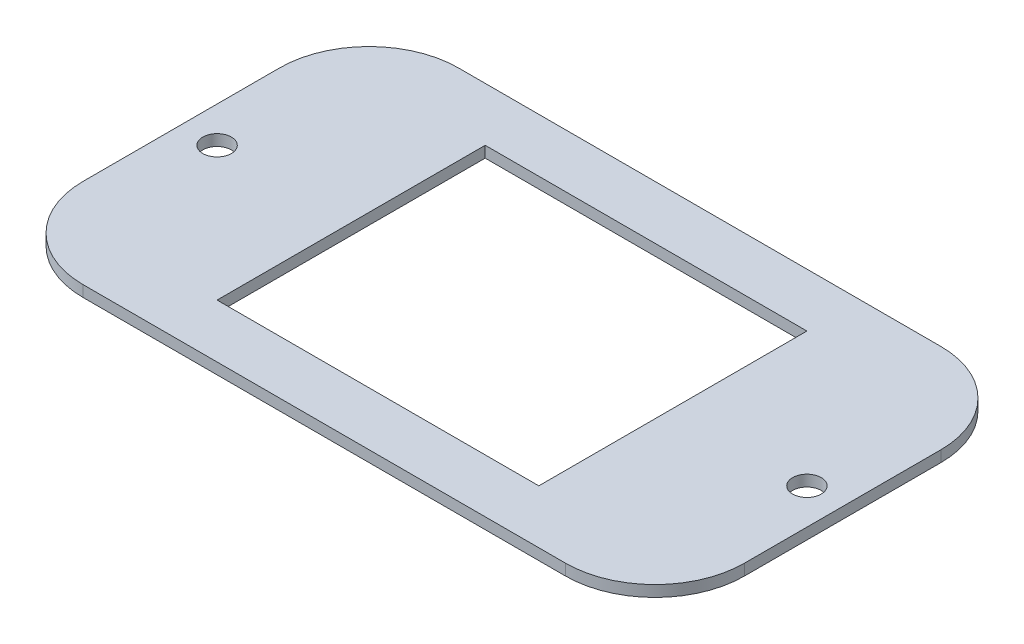
ISO-10303-21;
HEADER;
FILE_DESCRIPTION(('STEP AP214'),'2;1');
FILE_NAME('part.step','',(''),(''),'','','');
FILE_SCHEMA(('AUTOMOTIVE_DESIGN { 1 0 10303 214 1 1 1 1 }'));
ENDSEC;
DATA;
#1=APPLICATION_CONTEXT('core data for automotive mechanical design processes');
#2=APPLICATION_PROTOCOL_DEFINITION('international standard','automotive_design',2000,#1);
#3=PRODUCT_CONTEXT('',#1,'mechanical');
#4=PRODUCT('Part','Part','',(#3));
#5=PRODUCT_RELATED_PRODUCT_CATEGORY('part','',(#4));
#6=PRODUCT_DEFINITION_FORMATION('','',#4);
#7=PRODUCT_DEFINITION_CONTEXT('part definition',#1,'design');
#8=PRODUCT_DEFINITION('design','',#6,#7);
#9=PRODUCT_DEFINITION_SHAPE('','',#8);
#10=(LENGTH_UNIT() NAMED_UNIT(*) SI_UNIT(.MILLI.,.METRE.));
#11=(NAMED_UNIT(*) PLANE_ANGLE_UNIT() SI_UNIT($,.RADIAN.));
#12=(NAMED_UNIT(*) SI_UNIT($,.STERADIAN.) SOLID_ANGLE_UNIT());
#13=UNCERTAINTY_MEASURE_WITH_UNIT(LENGTH_MEASURE(1.E-05),#10,'distance_accuracy_value','');
#14=(GEOMETRIC_REPRESENTATION_CONTEXT(3) GLOBAL_UNCERTAINTY_ASSIGNED_CONTEXT((#13)) GLOBAL_UNIT_ASSIGNED_CONTEXT((#10,
#11,#12)) REPRESENTATION_CONTEXT('',''));
#15=CARTESIAN_POINT('',(0.,0.,0.));
#16=DIRECTION('',(0.,0.,1.));
#17=DIRECTION('',(1.,0.,0.));
#18=AXIS2_PLACEMENT_3D('',#15,#16,#17);
#19=CARTESIAN_POINT('',(0.,1.25,0.));
#20=DIRECTION('',(0.,-1.,0.));
#21=DIRECTION('',(0.,0.,-1.));
#22=AXIS2_PLACEMENT_3D('',#19,#20,#21);
#23=PLANE('',#22);
#24=CARTESIAN_POINT('',(33.,1.25,0.));
#25=DIRECTION('',(0.,1.,0.));
#26=DIRECTION('',(0.,0.,-1.));
#27=AXIS2_PLACEMENT_3D('',#24,#25,#26);
#28=CIRCLE('',#27,1.60000000000001);
#29=CARTESIAN_POINT('',(33.,1.25,-1.6));
#30=VERTEX_POINT('',#29);
#31=EDGE_CURVE('E191',#30,#30,#28,.T.);
#32=ORIENTED_EDGE('',*,*,#31,.F.);
#33=EDGE_LOOP('',(#32));
#34=FACE_BOUND('',#33,.T.);
#35=CARTESIAN_POINT('',(-33.,1.25,0.));
#36=DIRECTION('',(0.,1.,0.));
#37=DIRECTION('',(0.,0.,1.));
#38=AXIS2_PLACEMENT_3D('',#35,#36,#37);
#39=CIRCLE('',#38,1.60000000000001);
#40=CARTESIAN_POINT('',(-33.,1.25,1.60000000000001));
#41=VERTEX_POINT('',#40);
#42=EDGE_CURVE('E199',#41,#41,#39,.T.);
#43=ORIENTED_EDGE('',*,*,#42,.F.);
#44=EDGE_LOOP('',(#43));
#45=FACE_BOUND('',#44,.T.);
#46=DIRECTION('',(0.,0.,-1.));
#47=VECTOR('',#46,1.);
#48=CARTESIAN_POINT('',(37.,1.25,21.));
#49=LINE('',#48,#47);
#50=CARTESIAN_POINT('',(37.,1.25,11.));
#51=VERTEX_POINT('',#50);
#52=CARTESIAN_POINT('',(37.,1.25,-11.));
#53=VERTEX_POINT('',#52);
#54=EDGE_CURVE('E207',#51,#53,#49,.T.);
#55=ORIENTED_EDGE('',*,*,#54,.T.);
#56=CARTESIAN_POINT('',(27.,1.25,-11.));
#57=DIRECTION('',(0.,-1.,0.));
#58=DIRECTION('',(0.,0.,-1.));
#59=AXIS2_PLACEMENT_3D('',#56,#57,#58);
#60=CIRCLE('',#59,10.);
#61=CARTESIAN_POINT('',(27.,1.25,-21.));
#62=VERTEX_POINT('',#61);
#63=EDGE_CURVE('E269',#53,#62,#60,.F.);
#64=ORIENTED_EDGE('',*,*,#63,.T.);
#65=DIRECTION('',(-1.,0.,0.));
#66=VECTOR('',#65,1.);
#67=CARTESIAN_POINT('',(-37.,1.25,-21.));
#68=LINE('',#67,#66);
#69=CARTESIAN_POINT('',(-27.,1.25,-21.));
#70=VERTEX_POINT('',#69);
#71=EDGE_CURVE('E211',#62,#70,#68,.T.);
#72=ORIENTED_EDGE('',*,*,#71,.T.);
#73=CARTESIAN_POINT('',(-27.,1.25,-11.));
#74=DIRECTION('',(0.,-1.,0.));
#75=DIRECTION('',(0.,0.,-1.));
#76=AXIS2_PLACEMENT_3D('',#73,#74,#75);
#77=CIRCLE('',#76,10.);
#78=CARTESIAN_POINT('',(-37.,1.25,-11.));
#79=VERTEX_POINT('',#78);
#80=EDGE_CURVE('E263',#70,#79,#77,.F.);
#81=ORIENTED_EDGE('',*,*,#80,.T.);
#82=DIRECTION('',(0.,0.,1.));
#83=VECTOR('',#82,1.);
#84=CARTESIAN_POINT('',(-37.,1.25,21.));
#85=LINE('',#84,#83);
#86=CARTESIAN_POINT('',(-37.,1.25,11.));
#87=VERTEX_POINT('',#86);
#88=EDGE_CURVE('E216',#79,#87,#85,.T.);
#89=ORIENTED_EDGE('',*,*,#88,.T.);
#90=CARTESIAN_POINT('',(-27.,1.25,11.));
#91=DIRECTION('',(0.,-1.,0.));
#92=DIRECTION('',(0.,0.,-1.));
#93=AXIS2_PLACEMENT_3D('',#90,#91,#92);
#94=CIRCLE('',#93,10.);
#95=CARTESIAN_POINT('',(-27.,1.25,21.));
#96=VERTEX_POINT('',#95);
#97=EDGE_CURVE('E68',#87,#96,#94,.F.);
#98=ORIENTED_EDGE('',*,*,#97,.T.);
#99=DIRECTION('',(1.,0.,0.));
#100=VECTOR('',#99,1.);
#101=CARTESIAN_POINT('',(-37.,1.25,21.));
#102=LINE('',#101,#100);
#103=CARTESIAN_POINT('',(27.,1.25,21.));
#104=VERTEX_POINT('',#103);
#105=EDGE_CURVE('E219',#96,#104,#102,.T.);
#106=ORIENTED_EDGE('',*,*,#105,.T.);
#107=CARTESIAN_POINT('',(27.,1.25,11.));
#108=DIRECTION('',(0.,-1.,0.));
#109=DIRECTION('',(0.,0.,-1.));
#110=AXIS2_PLACEMENT_3D('',#107,#108,#109);
#111=CIRCLE('',#110,10.);
#112=EDGE_CURVE('E266',#104,#51,#111,.F.);
#113=ORIENTED_EDGE('',*,*,#112,.T.);
#114=EDGE_LOOP('',(#55,#64,#72,#81,#89,#98,#106,#113));
#115=FACE_BOUND('',#114,.T.);
#116=DIRECTION('',(0.,0.,1.));
#117=VECTOR('',#116,1.);
#118=CARTESIAN_POINT('',(-18.,1.25,15.));
#119=LINE('',#118,#117);
#120=CARTESIAN_POINT('',(-18.,1.25,-15.));
#121=VERTEX_POINT('',#120);
#122=CARTESIAN_POINT('',(-18.,1.25,15.));
#123=VERTEX_POINT('',#122);
#124=EDGE_CURVE('E138',#121,#123,#119,.T.);
#125=ORIENTED_EDGE('',*,*,#124,.F.);
#126=DIRECTION('',(-1.,0.,0.));
#127=VECTOR('',#126,1.);
#128=CARTESIAN_POINT('',(18.,1.25,-15.));
#129=LINE('',#128,#127);
#130=CARTESIAN_POINT('',(18.,1.25,-15.));
#131=VERTEX_POINT('',#130);
#132=EDGE_CURVE('E167',#131,#121,#129,.T.);
#133=ORIENTED_EDGE('',*,*,#132,.F.);
#134=DIRECTION('',(0.,0.,-1.));
#135=VECTOR('',#134,1.);
#136=CARTESIAN_POINT('',(18.,1.25,15.));
#137=LINE('',#136,#135);
#138=CARTESIAN_POINT('',(18.,1.25,15.));
#139=VERTEX_POINT('',#138);
#140=EDGE_CURVE('E163',#139,#131,#137,.T.);
#141=ORIENTED_EDGE('',*,*,#140,.F.);
#142=DIRECTION('',(1.,0.,0.));
#143=VECTOR('',#142,1.);
#144=CARTESIAN_POINT('',(18.,1.25,15.));
#145=LINE('',#144,#143);
#146=EDGE_CURVE('E149',#123,#139,#145,.T.);
#147=ORIENTED_EDGE('',*,*,#146,.F.);
#148=EDGE_LOOP('',(#125,#133,#141,#147));
#149=FACE_BOUND('',#148,.T.);
#150=ADVANCED_FACE('F45',(#34,#45,#115,#149),#23,.F.);
#151=CARTESIAN_POINT('',(0.,0.,0.));
#152=DIRECTION('',(0.,-1.,0.));
#153=DIRECTION('',(0.,0.,-1.));
#154=AXIS2_PLACEMENT_3D('',#151,#152,#153);
#155=PLANE('',#154);
#156=CARTESIAN_POINT('',(-33.,0.,0.));
#157=DIRECTION('',(0.,1.,0.));
#158=DIRECTION('',(0.,0.,1.));
#159=AXIS2_PLACEMENT_3D('',#156,#157,#158);
#160=CIRCLE('',#159,1.60000000000001);
#161=CARTESIAN_POINT('',(-33.,0.,1.60000000000001));
#162=VERTEX_POINT('',#161);
#163=EDGE_CURVE('E195',#162,#162,#160,.T.);
#164=ORIENTED_EDGE('',*,*,#163,.T.);
#165=EDGE_LOOP('',(#164));
#166=FACE_BOUND('',#165,.T.);
#167=DIRECTION('',(-1.,0.,0.));
#168=VECTOR('',#167,1.);
#169=CARTESIAN_POINT('',(-37.,0.,-21.));
#170=LINE('',#169,#168);
#171=CARTESIAN_POINT('',(27.,0.,-21.));
#172=VERTEX_POINT('',#171);
#173=CARTESIAN_POINT('',(-27.,0.,-21.));
#174=VERTEX_POINT('',#173);
#175=EDGE_CURVE('E226',#172,#174,#170,.T.);
#176=ORIENTED_EDGE('',*,*,#175,.F.);
#177=CARTESIAN_POINT('',(27.,0.,-11.));
#178=DIRECTION('',(0.,-1.,0.));
#179=DIRECTION('',(0.,0.,-1.));
#180=AXIS2_PLACEMENT_3D('',#177,#178,#179);
#181=CIRCLE('',#180,10.);
#182=CARTESIAN_POINT('',(37.,0.,-11.));
#183=VERTEX_POINT('',#182);
#184=EDGE_CURVE('E251',#172,#183,#181,.T.);
#185=ORIENTED_EDGE('',*,*,#184,.T.);
#186=DIRECTION('',(0.,0.,-1.));
#187=VECTOR('',#186,1.);
#188=CARTESIAN_POINT('',(37.,0.,21.));
#189=LINE('',#188,#187);
#190=CARTESIAN_POINT('',(37.,0.,11.));
#191=VERTEX_POINT('',#190);
#192=EDGE_CURVE('E203',#191,#183,#189,.T.);
#193=ORIENTED_EDGE('',*,*,#192,.F.);
#194=CARTESIAN_POINT('',(27.,0.,11.));
#195=DIRECTION('',(0.,-1.,0.));
#196=DIRECTION('',(0.,0.,-1.));
#197=AXIS2_PLACEMENT_3D('',#194,#195,#196);
#198=CIRCLE('',#197,10.);
#199=CARTESIAN_POINT('',(27.,0.,21.));
#200=VERTEX_POINT('',#199);
#201=EDGE_CURVE('E248',#191,#200,#198,.T.);
#202=ORIENTED_EDGE('',*,*,#201,.T.);
#203=DIRECTION('',(1.,0.,0.));
#204=VECTOR('',#203,1.);
#205=CARTESIAN_POINT('',(-37.,0.,21.));
#206=LINE('',#205,#204);
#207=CARTESIAN_POINT('',(-27.,0.,21.));
#208=VERTEX_POINT('',#207);
#209=EDGE_CURVE('E212',#208,#200,#206,.T.);
#210=ORIENTED_EDGE('',*,*,#209,.F.);
#211=CARTESIAN_POINT('',(-27.,0.,11.));
#212=DIRECTION('',(0.,-1.,0.));
#213=DIRECTION('',(0.,0.,-1.));
#214=AXIS2_PLACEMENT_3D('',#211,#212,#213);
#215=CIRCLE('',#214,10.);
#216=CARTESIAN_POINT('',(-37.,0.,11.));
#217=VERTEX_POINT('',#216);
#218=EDGE_CURVE('E242',#208,#217,#215,.T.);
#219=ORIENTED_EDGE('',*,*,#218,.T.);
#220=DIRECTION('',(0.,0.,1.));
#221=VECTOR('',#220,1.);
#222=CARTESIAN_POINT('',(-37.,0.,21.));
#223=LINE('',#222,#221);
#224=CARTESIAN_POINT('',(-37.,0.,-11.));
#225=VERTEX_POINT('',#224);
#226=EDGE_CURVE('E230',#225,#217,#223,.T.);
#227=ORIENTED_EDGE('',*,*,#226,.F.);
#228=CARTESIAN_POINT('',(-27.,0.,-11.));
#229=DIRECTION('',(0.,-1.,0.));
#230=DIRECTION('',(0.,0.,-1.));
#231=AXIS2_PLACEMENT_3D('',#228,#229,#230);
#232=CIRCLE('',#231,10.);
#233=EDGE_CURVE('E245',#225,#174,#232,.T.);
#234=ORIENTED_EDGE('',*,*,#233,.T.);
#235=EDGE_LOOP('',(#176,#185,#193,#202,#210,#219,#227,#234));
#236=FACE_BOUND('',#235,.T.);
#237=CARTESIAN_POINT('',(33.,0.,0.));
#238=DIRECTION('',(0.,1.,0.));
#239=DIRECTION('',(0.,0.,-1.));
#240=AXIS2_PLACEMENT_3D('',#237,#238,#239);
#241=CIRCLE('',#240,1.60000000000001);
#242=CARTESIAN_POINT('',(33.,0.,-1.6));
#243=VERTEX_POINT('',#242);
#244=EDGE_CURVE('E158',#243,#243,#241,.T.);
#245=ORIENTED_EDGE('',*,*,#244,.T.);
#246=EDGE_LOOP('',(#245));
#247=FACE_BOUND('',#246,.T.);
#248=DIRECTION('',(-1.,0.,0.));
#249=VECTOR('',#248,1.);
#250=CARTESIAN_POINT('',(18.,0.,-15.));
#251=LINE('',#250,#249);
#252=CARTESIAN_POINT('',(18.,0.,-15.));
#253=VERTEX_POINT('',#252);
#254=CARTESIAN_POINT('',(-18.,0.,-15.));
#255=VERTEX_POINT('',#254);
#256=EDGE_CURVE('E150',#253,#255,#251,.T.);
#257=ORIENTED_EDGE('',*,*,#256,.T.);
#258=DIRECTION('',(0.,0.,1.));
#259=VECTOR('',#258,1.);
#260=CARTESIAN_POINT('',(-18.,0.,15.));
#261=LINE('',#260,#259);
#262=CARTESIAN_POINT('',(-18.,0.,15.));
#263=VERTEX_POINT('',#262);
#264=EDGE_CURVE('E172',#255,#263,#261,.T.);
#265=ORIENTED_EDGE('',*,*,#264,.T.);
#266=DIRECTION('',(1.,0.,0.));
#267=VECTOR('',#266,1.);
#268=CARTESIAN_POINT('',(18.,0.,15.));
#269=LINE('',#268,#267);
#270=CARTESIAN_POINT('',(18.,0.,15.));
#271=VERTEX_POINT('',#270);
#272=EDGE_CURVE('E156',#263,#271,#269,.T.);
#273=ORIENTED_EDGE('',*,*,#272,.T.);
#274=DIRECTION('',(0.,0.,-1.));
#275=VECTOR('',#274,1.);
#276=CARTESIAN_POINT('',(18.,0.,15.));
#277=LINE('',#276,#275);
#278=EDGE_CURVE('E177',#271,#253,#277,.T.);
#279=ORIENTED_EDGE('',*,*,#278,.T.);
#280=EDGE_LOOP('',(#257,#265,#273,#279));
#281=FACE_BOUND('',#280,.T.);
#282=ADVANCED_FACE('F291',(#166,#236,#247,#281),#155,.T.);
#283=CARTESIAN_POINT('',(37.,1.25,21.));
#284=DIRECTION('',(-1.,0.,0.));
#285=DIRECTION('',(0.,0.,1.));
#286=AXIS2_PLACEMENT_3D('',#283,#284,#285);
#287=PLANE('',#286);
#288=ORIENTED_EDGE('',*,*,#192,.T.);
#289=DIRECTION('',(0.,-1.,0.));
#290=VECTOR('',#289,1.);
#291=CARTESIAN_POINT('',(37.,1.25,-11.));
#292=LINE('',#291,#290);
#293=EDGE_CURVE('E258',#183,#53,#292,.F.);
#294=ORIENTED_EDGE('',*,*,#293,.T.);
#295=ORIENTED_EDGE('',*,*,#54,.F.);
#296=DIRECTION('',(0.,-1.,0.));
#297=VECTOR('',#296,1.);
#298=CARTESIAN_POINT('',(37.,1.25,11.));
#299=LINE('',#298,#297);
#300=EDGE_CURVE('E254',#51,#191,#299,.T.);
#301=ORIENTED_EDGE('',*,*,#300,.T.);
#302=EDGE_LOOP('',(#288,#294,#295,#301));
#303=FACE_BOUND('',#302,.T.);
#304=ADVANCED_FACE('F300',(#303),#287,.F.);
#305=CARTESIAN_POINT('',(-37.,1.25,-21.));
#306=DIRECTION('',(0.,0.,1.));
#307=DIRECTION('',(1.,0.,0.));
#308=AXIS2_PLACEMENT_3D('',#305,#306,#307);
#309=PLANE('',#308);
#310=ORIENTED_EDGE('',*,*,#71,.F.);
#311=DIRECTION('',(0.,-1.,0.));
#312=VECTOR('',#311,1.);
#313=CARTESIAN_POINT('',(27.,1.25,-21.));
#314=LINE('',#313,#312);
#315=EDGE_CURVE('E238',#62,#172,#314,.T.);
#316=ORIENTED_EDGE('',*,*,#315,.T.);
#317=ORIENTED_EDGE('',*,*,#175,.T.);
#318=DIRECTION('',(0.,-1.,0.));
#319=VECTOR('',#318,1.);
#320=CARTESIAN_POINT('',(-27.,1.25,-21.));
#321=LINE('',#320,#319);
#322=EDGE_CURVE('E222',#174,#70,#321,.F.);
#323=ORIENTED_EDGE('',*,*,#322,.T.);
#324=EDGE_LOOP('',(#310,#316,#317,#323));
#325=FACE_BOUND('',#324,.T.);
#326=ADVANCED_FACE('F308',(#325),#309,.F.);
#327=CARTESIAN_POINT('',(-37.,1.25,21.));
#328=DIRECTION('',(1.,0.,0.));
#329=DIRECTION('',(0.,0.,-1.));
#330=AXIS2_PLACEMENT_3D('',#327,#328,#329);
#331=PLANE('',#330);
#332=ORIENTED_EDGE('',*,*,#88,.F.);
#333=DIRECTION('',(0.,-1.,0.));
#334=VECTOR('',#333,1.);
#335=CARTESIAN_POINT('',(-37.,1.25,-11.));
#336=LINE('',#335,#334);
#337=EDGE_CURVE('E11',#79,#225,#336,.T.);
#338=ORIENTED_EDGE('',*,*,#337,.T.);
#339=ORIENTED_EDGE('',*,*,#226,.T.);
#340=DIRECTION('',(0.,-1.,0.));
#341=VECTOR('',#340,1.);
#342=CARTESIAN_POINT('',(-37.,1.25,11.));
#343=LINE('',#342,#341);
#344=EDGE_CURVE('E54',#217,#87,#343,.F.);
#345=ORIENTED_EDGE('',*,*,#344,.T.);
#346=EDGE_LOOP('',(#332,#338,#339,#345));
#347=FACE_BOUND('',#346,.T.);
#348=ADVANCED_FACE('F281',(#347),#331,.F.);
#349=CARTESIAN_POINT('',(-37.,1.25,21.));
#350=DIRECTION('',(0.,0.,-1.));
#351=DIRECTION('',(-1.,0.,0.));
#352=AXIS2_PLACEMENT_3D('',#349,#350,#351);
#353=PLANE('',#352);
#354=ORIENTED_EDGE('',*,*,#209,.T.);
#355=DIRECTION('',(0.,-1.,0.));
#356=VECTOR('',#355,1.);
#357=CARTESIAN_POINT('',(27.,1.25,21.));
#358=LINE('',#357,#356);
#359=EDGE_CURVE('E61',#200,#104,#358,.F.);
#360=ORIENTED_EDGE('',*,*,#359,.T.);
#361=ORIENTED_EDGE('',*,*,#105,.F.);
#362=DIRECTION('',(0.,-1.,0.));
#363=VECTOR('',#362,1.);
#364=CARTESIAN_POINT('',(-27.,1.25,21.));
#365=LINE('',#364,#363);
#366=EDGE_CURVE('E272',#96,#208,#365,.T.);
#367=ORIENTED_EDGE('',*,*,#366,.T.);
#368=EDGE_LOOP('',(#354,#360,#361,#367));
#369=FACE_BOUND('',#368,.T.);
#370=ADVANCED_FACE('F288',(#369),#353,.F.);
#371=CARTESIAN_POINT('',(-33.,1.25,0.));
#372=DIRECTION('',(0.,-1.,0.));
#373=DIRECTION('',(0.,0.,-1.));
#374=AXIS2_PLACEMENT_3D('',#371,#372,#373);
#375=CYLINDRICAL_SURFACE('',#374,1.60000000000001);
#376=ORIENTED_EDGE('',*,*,#42,.T.);
#377=EDGE_LOOP('',(#376));
#378=FACE_BOUND('',#377,.T.);
#379=ORIENTED_EDGE('',*,*,#163,.F.);
#380=EDGE_LOOP('',(#379));
#381=FACE_BOUND('',#380,.T.);
#382=ADVANCED_FACE('F330',(#378,#381),#375,.F.);
#383=CARTESIAN_POINT('',(33.,1.25,0.));
#384=DIRECTION('',(0.,-1.,0.));
#385=DIRECTION('',(0.,0.,-1.));
#386=AXIS2_PLACEMENT_3D('',#383,#384,#385);
#387=CYLINDRICAL_SURFACE('',#386,1.60000000000001);
#388=ORIENTED_EDGE('',*,*,#31,.T.);
#389=EDGE_LOOP('',(#388));
#390=FACE_BOUND('',#389,.T.);
#391=ORIENTED_EDGE('',*,*,#244,.F.);
#392=EDGE_LOOP('',(#391));
#393=FACE_BOUND('',#392,.T.);
#394=ADVANCED_FACE('F358',(#390,#393),#387,.F.);
#395=CARTESIAN_POINT('',(-18.,1.25,15.));
#396=DIRECTION('',(1.,0.,0.));
#397=DIRECTION('',(0.,0.,-1.));
#398=AXIS2_PLACEMENT_3D('',#395,#396,#397);
#399=PLANE('',#398);
#400=ORIENTED_EDGE('',*,*,#264,.F.);
#401=DIRECTION('',(0.,-1.,0.));
#402=VECTOR('',#401,1.);
#403=CARTESIAN_POINT('',(-18.,1.25,-15.));
#404=LINE('',#403,#402);
#405=EDGE_CURVE('E144',#121,#255,#404,.T.);
#406=ORIENTED_EDGE('',*,*,#405,.F.);
#407=ORIENTED_EDGE('',*,*,#124,.T.);
#408=DIRECTION('',(0.,-1.,0.));
#409=VECTOR('',#408,1.);
#410=CARTESIAN_POINT('',(-18.,1.25,15.));
#411=LINE('',#410,#409);
#412=EDGE_CURVE('E141',#123,#263,#411,.T.);
#413=ORIENTED_EDGE('',*,*,#412,.T.);
#414=EDGE_LOOP('',(#400,#406,#407,#413));
#415=FACE_BOUND('',#414,.T.);
#416=ADVANCED_FACE('F140',(#415),#399,.T.);
#417=CARTESIAN_POINT('',(18.,1.25,15.));
#418=DIRECTION('',(0.,0.,-1.));
#419=DIRECTION('',(-1.,0.,0.));
#420=AXIS2_PLACEMENT_3D('',#417,#418,#419);
#421=PLANE('',#420);
#422=ORIENTED_EDGE('',*,*,#272,.F.);
#423=ORIENTED_EDGE('',*,*,#412,.F.);
#424=ORIENTED_EDGE('',*,*,#146,.T.);
#425=DIRECTION('',(0.,-1.,0.));
#426=VECTOR('',#425,1.);
#427=CARTESIAN_POINT('',(18.,1.25,15.));
#428=LINE('',#427,#426);
#429=EDGE_CURVE('E159',#139,#271,#428,.T.);
#430=ORIENTED_EDGE('',*,*,#429,.T.);
#431=EDGE_LOOP('',(#422,#423,#424,#430));
#432=FACE_BOUND('',#431,.T.);
#433=ADVANCED_FACE('F153',(#432),#421,.T.);
#434=CARTESIAN_POINT('',(18.,1.25,15.));
#435=DIRECTION('',(-1.,0.,0.));
#436=DIRECTION('',(0.,0.,1.));
#437=AXIS2_PLACEMENT_3D('',#434,#435,#436);
#438=PLANE('',#437);
#439=ORIENTED_EDGE('',*,*,#278,.F.);
#440=ORIENTED_EDGE('',*,*,#429,.F.);
#441=ORIENTED_EDGE('',*,*,#140,.T.);
#442=DIRECTION('',(0.,-1.,0.));
#443=VECTOR('',#442,1.);
#444=CARTESIAN_POINT('',(18.,1.25,-15.));
#445=LINE('',#444,#443);
#446=EDGE_CURVE('E186',#131,#253,#445,.T.);
#447=ORIENTED_EDGE('',*,*,#446,.T.);
#448=EDGE_LOOP('',(#439,#440,#441,#447));
#449=FACE_BOUND('',#448,.T.);
#450=ADVANCED_FACE('F345',(#449),#438,.T.);
#451=CARTESIAN_POINT('',(18.,1.25,-15.));
#452=DIRECTION('',(0.,0.,1.));
#453=DIRECTION('',(1.,0.,0.));
#454=AXIS2_PLACEMENT_3D('',#451,#452,#453);
#455=PLANE('',#454);
#456=ORIENTED_EDGE('',*,*,#256,.F.);
#457=ORIENTED_EDGE('',*,*,#446,.F.);
#458=ORIENTED_EDGE('',*,*,#132,.T.);
#459=ORIENTED_EDGE('',*,*,#405,.T.);
#460=EDGE_LOOP('',(#456,#457,#458,#459));
#461=FACE_BOUND('',#460,.T.);
#462=ADVANCED_FACE('F342',(#461),#455,.T.);
#463=CARTESIAN_POINT('',(27.,1.25,-11.));
#464=DIRECTION('',(0.,-1.,0.));
#465=DIRECTION('',(0.,0.,-1.));
#466=AXIS2_PLACEMENT_3D('',#463,#464,#465);
#467=CYLINDRICAL_SURFACE('',#466,10.);
#468=ORIENTED_EDGE('',*,*,#63,.F.);
#469=ORIENTED_EDGE('',*,*,#293,.F.);
#470=ORIENTED_EDGE('',*,*,#184,.F.);
#471=ORIENTED_EDGE('',*,*,#315,.F.);
#472=EDGE_LOOP('',(#468,#469,#470,#471));
#473=FACE_BOUND('',#472,.T.);
#474=ADVANCED_FACE('F306',(#473),#467,.T.);
#475=CARTESIAN_POINT('',(27.,1.25,11.));
#476=DIRECTION('',(0.,-1.,0.));
#477=DIRECTION('',(0.,0.,-1.));
#478=AXIS2_PLACEMENT_3D('',#475,#476,#477);
#479=CYLINDRICAL_SURFACE('',#478,10.);
#480=ORIENTED_EDGE('',*,*,#112,.F.);
#481=ORIENTED_EDGE('',*,*,#359,.F.);
#482=ORIENTED_EDGE('',*,*,#201,.F.);
#483=ORIENTED_EDGE('',*,*,#300,.F.);
#484=EDGE_LOOP('',(#480,#481,#482,#483));
#485=FACE_BOUND('',#484,.T.);
#486=ADVANCED_FACE('F297',(#485),#479,.T.);
#487=CARTESIAN_POINT('',(-27.,1.25,-11.));
#488=DIRECTION('',(0.,-1.,0.));
#489=DIRECTION('',(0.,0.,-1.));
#490=AXIS2_PLACEMENT_3D('',#487,#488,#489);
#491=CYLINDRICAL_SURFACE('',#490,10.);
#492=ORIENTED_EDGE('',*,*,#80,.F.);
#493=ORIENTED_EDGE('',*,*,#322,.F.);
#494=ORIENTED_EDGE('',*,*,#233,.F.);
#495=ORIENTED_EDGE('',*,*,#337,.F.);
#496=EDGE_LOOP('',(#492,#493,#494,#495));
#497=FACE_BOUND('',#496,.T.);
#498=ADVANCED_FACE('F311',(#497),#491,.T.);
#499=CARTESIAN_POINT('',(-27.,1.25,11.));
#500=DIRECTION('',(0.,-1.,0.));
#501=DIRECTION('',(0.,0.,-1.));
#502=AXIS2_PLACEMENT_3D('',#499,#500,#501);
#503=CYLINDRICAL_SURFACE('',#502,10.);
#504=ORIENTED_EDGE('',*,*,#97,.F.);
#505=ORIENTED_EDGE('',*,*,#344,.F.);
#506=ORIENTED_EDGE('',*,*,#218,.F.);
#507=ORIENTED_EDGE('',*,*,#366,.F.);
#508=EDGE_LOOP('',(#504,#505,#506,#507));
#509=FACE_BOUND('',#508,.T.);
#510=ADVANCED_FACE('F47',(#509),#503,.T.);
#511=CLOSED_SHELL('',(#150,#282,#304,#326,#348,#370,#382,#394,#416,#433,#450,#462,#474,#486,
#498,#510));
#512=MANIFOLD_SOLID_BREP('B2',#511);
#513=ADVANCED_BREP_SHAPE_REPRESENTATION('',(#18,#512),#14);
#514=SHAPE_DEFINITION_REPRESENTATION(#9,#513);
ENDSEC;
END-ISO-10303-21;
